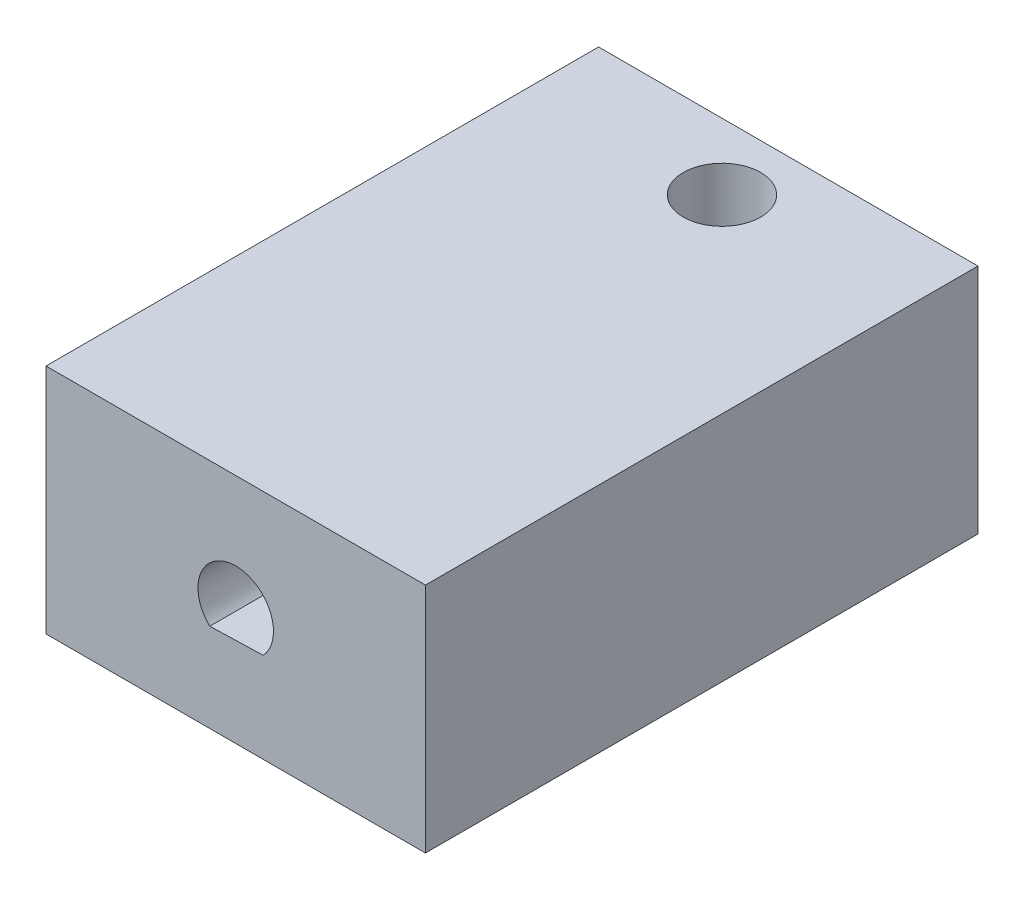
ISO-10303-21;
HEADER;
FILE_DESCRIPTION(('STEP AP214'),'2;1');
FILE_NAME('part.step','',(''),(''),'','','');
FILE_SCHEMA(('AUTOMOTIVE_DESIGN { 1 0 10303 214 1 1 1 1 }'));
ENDSEC;
DATA;
#1=APPLICATION_CONTEXT('core data for automotive mechanical design processes');
#2=APPLICATION_PROTOCOL_DEFINITION('international standard','automotive_design',2000,#1);
#3=PRODUCT_CONTEXT('',#1,'mechanical');
#4=PRODUCT('Part','Part','',(#3));
#5=PRODUCT_RELATED_PRODUCT_CATEGORY('part','',(#4));
#6=PRODUCT_DEFINITION_FORMATION('','',#4);
#7=PRODUCT_DEFINITION_CONTEXT('part definition',#1,'design');
#8=PRODUCT_DEFINITION('design','',#6,#7);
#9=PRODUCT_DEFINITION_SHAPE('','',#8);
#10=(LENGTH_UNIT() NAMED_UNIT(*) SI_UNIT(.MILLI.,.METRE.));
#11=(NAMED_UNIT(*) PLANE_ANGLE_UNIT() SI_UNIT($,.RADIAN.));
#12=(NAMED_UNIT(*) SI_UNIT($,.STERADIAN.) SOLID_ANGLE_UNIT());
#13=UNCERTAINTY_MEASURE_WITH_UNIT(LENGTH_MEASURE(1.E-05),#10,'distance_accuracy_value','');
#14=(GEOMETRIC_REPRESENTATION_CONTEXT(3) GLOBAL_UNCERTAINTY_ASSIGNED_CONTEXT((#13)) GLOBAL_UNIT_ASSIGNED_CONTEXT((#10,
#11,#12)) REPRESENTATION_CONTEXT('',''));
#15=CARTESIAN_POINT('',(0.,0.,0.));
#16=DIRECTION('',(0.,0.,1.));
#17=DIRECTION('',(1.,0.,0.));
#18=AXIS2_PLACEMENT_3D('',#15,#16,#17);
#19=CARTESIAN_POINT('',(0.,0.,0.));
#20=DIRECTION('',(0.,0.,1.));
#21=DIRECTION('',(1.,0.,0.));
#22=AXIS2_PLACEMENT_3D('',#19,#20,#21);
#23=CYLINDRICAL_SURFACE('',#22,2.05);
#24=DIRECTION('',(0.,0.,1.));
#25=VECTOR('',#24,1.);
#26=CARTESIAN_POINT('',(-1.40815423621281,-1.48983275807586,0.));
#27=LINE('',#26,#25);
#28=CARTESIAN_POINT('',(-1.40815423621281,-1.48983275807586,5.15791580229354));
#29=VERTEX_POINT('',#28);
#30=CARTESIAN_POINT('',(-1.40815423621281,-1.48983275807586,30.));
#31=VERTEX_POINT('',#30);
#32=EDGE_CURVE('E61',#29,#31,#27,.T.);
#33=ORIENTED_EDGE('',*,*,#32,.F.);
#34=CARTESIAN_POINT('',(-1.40815423621281,-1.48983275807586,5.15791580229354));
#35=CARTESIAN_POINT('',(-1.46072595876663,-1.4401052639686,5.11038785072848));
#36=CARTESIAN_POINT('',(-1.50983627572329,-1.38845438215111,5.06117473554368));
#37=CARTESIAN_POINT('',(-1.60136165196883,-1.28183538172913,4.96025175632157));
#38=CARTESIAN_POINT('',(-1.64378069794721,-1.22686926555099,4.90854340312661));
#39=CARTESIAN_POINT('',(-1.72288829557476,-1.11311814906605,4.80254024968019));
#40=CARTESIAN_POINT('',(-1.75946565693852,-1.05428370461202,4.74821625134745));
#41=CARTESIAN_POINT('',(-1.82623513684594,-0.933868657104844,4.63873363889227));
#42=CARTESIAN_POINT('',(-1.85642918965869,-0.872288892806526,4.58357528304107));
#43=CARTESIAN_POINT('',(-1.90041664053693,-0.76989914588715,4.49435931142008));
#44=CARTESIAN_POINT('',(-1.91610462630804,-0.729999153578874,4.46017668109492));
#45=CARTESIAN_POINT('',(-1.94510870898345,-0.648779868574377,4.39240662525315));
#46=CARTESIAN_POINT('',(-1.95842284917883,-0.607459438196541,4.35881971111795));
#47=CARTESIAN_POINT('',(-1.98255245988595,-0.523342796035227,4.29332135803781));
#48=CARTESIAN_POINT('',(-1.99338635556343,-0.480560374461849,4.26139902202847));
#49=CARTESIAN_POINT('',(-2.01258094783862,-0.392495143611016,4.2004353703747));
#50=CARTESIAN_POINT('',(-2.02094718381927,-0.347218209601734,4.17138770070095));
#51=CARTESIAN_POINT('',(-2.03171465834737,-0.274407701619131,4.13136955444224));
#52=CARTESIAN_POINT('',(-2.0350929316301,-0.248245125072647,4.11821287360524));
#53=CARTESIAN_POINT('',(-2.04092566132897,-0.19455554011108,4.09473946093028));
#54=CARTESIAN_POINT('',(-2.04338078362491,-0.167029531438269,4.08442068352727));
#55=CARTESIAN_POINT('',(-2.04725715557626,-0.109884811462834,4.06777752923863));
#56=CARTESIAN_POINT('',(-2.04865058455454,-0.0802307183702288,4.06156117521208));
#57=CARTESIAN_POINT('',(-2.05011722198152,-0.0202804814999997,4.05500985267489));
#58=CARTESIAN_POINT('',(-2.05019415439684,0.0100136084548958,4.05465829451919));
#59=CARTESIAN_POINT('',(-2.04902678339541,0.0699093920586796,4.0598840634812));
#60=CARTESIAN_POINT('',(-2.04778710795098,0.0995131396608114,4.06544062321313));
#61=CARTESIAN_POINT('',(-2.04415213674626,0.157456254903078,4.08114967815378));
#62=CARTESIAN_POINT('',(-2.04175176408274,0.18578946459092,4.09132235214994));
#63=CARTESIAN_POINT('',(-2.03521826652576,0.248225988943511,4.11779805496029));
#64=CARTESIAN_POINT('',(-2.03079612429173,0.281899834017134,4.13500861840543));
#65=CARTESIAN_POINT('',(-2.02061342450096,0.347449560862371,4.17227666261223));
#66=CARTESIAN_POINT('',(-2.01484983135898,0.379321157883914,4.19234055954969));
#67=CARTESIAN_POINT('',(-1.99565263282213,0.473279021930297,4.25519099572552));
#68=CARTESIAN_POINT('',(-1.98035770386526,0.53331877660188,4.30043357594979));
#69=CARTESIAN_POINT('',(-1.94309887201904,0.656862900525792,4.39840878477754));
#70=CARTESIAN_POINT('',(-1.92057106674652,0.71997414422435,4.45140513027165));
#71=CARTESIAN_POINT('',(-1.86967476710487,0.843367312793429,4.5580247596515));
#72=CARTESIAN_POINT('',(-1.84130070326806,0.903646471920357,4.61164859503142));
#73=CARTESIAN_POINT('',(-1.77867249424366,1.02139745543362,4.71809177885831));
#74=CARTESIAN_POINT('',(-1.74443848141531,1.07887805367711,4.77091322900558));
#75=CARTESIAN_POINT('',(-1.66983636377927,1.19108390393229,4.87504819416792));
#76=CARTESIAN_POINT('',(-1.62947173223454,1.24581069287153,4.92636254350027));
#77=CARTESIAN_POINT('',(-1.51934480562176,1.38026554275981,5.05323934102415));
#78=CARTESIAN_POINT('',(-1.44530212092055,1.45796570752467,5.12732508270295));
#79=CARTESIAN_POINT('',(-1.28150322211045,1.60382015844931,5.26712833950586));
#80=CARTESIAN_POINT('',(-1.19176525651842,1.6719853668079,5.33285542141709));
#81=CARTESIAN_POINT('',(-1.01867025695916,1.78122575484393,5.43851035217611));
#82=CARTESIAN_POINT('',(-0.938501647051748,1.82493644251659,5.48090626459752));
#83=CARTESIAN_POINT('',(-0.76931249852997,1.90244479175973,5.55619822557943));
#84=CARTESIAN_POINT('',(-0.680297212782123,1.93624828935925,5.58909986675408));
#85=CARTESIAN_POINT('',(-0.49415251793504,1.99194066027947,5.64335204486058));
#86=CARTESIAN_POINT('',(-0.396952936141798,2.0137110936783,5.66458774339831));
#87=CARTESIAN_POINT('',(-0.198430877742551,2.04282908203838,5.69299787794504));
#88=CARTESIAN_POINT('',(-0.0971131230477907,2.05019270483358,5.70018797891531));
#89=CARTESIAN_POINT('',(0.090060543797335,2.04982874962433,5.69983294389339));
#90=CARTESIAN_POINT('',(0.175937168539728,2.04421533686945,5.69435210142198));
#91=CARTESIAN_POINT('',(0.345061361446952,2.02254756890112,5.67320839986189));
#92=CARTESIAN_POINT('',(0.428308747752626,2.0064924931099,5.65754483806514));
#93=CARTESIAN_POINT('',(0.588818331655834,1.96534006004454,5.61743415932635));
#94=CARTESIAN_POINT('',(0.666152861541083,1.94038549225447,5.59312576227703));
#95=CARTESIAN_POINT('',(0.814959637007834,1.88274225527095,5.53705308525009));
#96=CARTESIAN_POINT('',(0.886430028721757,1.85005115286726,5.50528645961694));
#97=CARTESIAN_POINT('',(1.05522435943943,1.76122431578013,5.41913160531703));
#98=CARTESIAN_POINT('',(1.14874496628292,1.70132077327748,5.36115797665548));
#99=CARTESIAN_POINT('',(1.32123831826599,1.571168013644,5.23577930881212));
#100=CARTESIAN_POINT('',(1.40016775927796,1.5008890800398,5.16834720796679));
#101=CARTESIAN_POINT('',(1.57069048918538,1.32497369068418,5.00072537578338));
#102=CARTESIAN_POINT('',(1.65601348423593,1.21593134974888,4.8977035707251));
#103=CARTESIAN_POINT('',(1.76517896350091,1.04461197951695,4.73941214664669));
#104=CARTESIAN_POINT('',(1.79842633943167,0.98622492968633,4.68603258028578));
#105=CARTESIAN_POINT('',(1.85893253429065,0.866806657624313,4.57884661374421));
#106=CARTESIAN_POINT('',(1.88619463949404,0.805776908544838,4.52504046468371));
#107=CARTESIAN_POINT('',(1.92891258083825,0.695964409218997,4.43142170837511));
#108=CARTESIAN_POINT('',(1.9456252706999,0.647836144333785,4.39140457725054));
#109=CARTESIAN_POINT('',(1.9757464110151,0.54917854301788,4.31287069555458));
#110=CARTESIAN_POINT('',(1.98914948640493,0.498645457644897,4.27435647010664));
#111=CARTESIAN_POINT('',(2.01021653441332,0.404226040316192,4.20826812297202));
#112=CARTESIAN_POINT('',(2.0184893701762,0.360950074106205,4.18002051686793));
#113=CARTESIAN_POINT('',(2.03251682298398,0.270990499035976,4.12873958168776));
#114=CARTESIAN_POINT('',(2.0382825044833,0.224322945612066,4.10568356337581));
#115=CARTESIAN_POINT('',(2.04474048866354,0.149098497609969,4.07868401727659));
#116=CARTESIAN_POINT('',(2.04654635746253,0.122103512675873,4.07082892583998));
#117=CARTESIAN_POINT('',(2.0490824201587,0.0671712665773229,4.05966820467643));
#118=CARTESIAN_POINT('',(2.0498160747706,0.0392373359806315,4.05634794046954));
#119=CARTESIAN_POINT('',(2.05012322906244,-0.0169277901047765,4.05496853419986));
#120=CARTESIAN_POINT('',(2.04969040106275,-0.0451597760784239,4.05693808698049));
#121=CARTESIAN_POINT('',(2.04770936081155,-0.100837538913112,4.06572933783776));
#122=CARTESIAN_POINT('',(2.04615832820992,-0.128281144954737,4.07256330444809));
#123=CARTESIAN_POINT('',(2.04220978678087,-0.180342027086592,4.08933407384598));
#124=CARTESIAN_POINT('',(2.03986580735057,-0.205031167046497,4.09907089731753));
#125=CARTESIAN_POINT('',(2.03443537648998,-0.253302623173413,4.1207672582427));
#126=CARTESIAN_POINT('',(2.03134883840891,-0.276884809783532,4.13272705506283));
#127=CARTESIAN_POINT('',(2.02231231850204,-0.337981466788771,4.16631751890859));
#128=CARTESIAN_POINT('',(2.01579742202397,-0.374702087567059,4.18922099652561));
#129=CARTESIAN_POINT('',(2.00114780002328,-0.446364943769399,4.23721738697977));
#130=CARTESIAN_POINT('',(1.99301065255741,-0.481304420899645,4.26231354152525));
#131=CARTESIAN_POINT('',(1.96621110791078,-0.584462461846287,4.33957471829017));
#132=CARTESIAN_POINT('',(1.94520611347937,-0.650731972447298,4.3935298941111));
#133=CARTESIAN_POINT('',(1.89684071587501,-0.78058773753741,4.50313661408542));
#134=CARTESIAN_POINT('',(1.86941868451949,-0.844140414525308,4.55879974451737));
#135=CARTESIAN_POINT('',(1.8082504952058,-0.968247358754713,4.66968477574737));
#136=CARTESIAN_POINT('',(1.77452031946858,-1.02880872503074,4.72490743173797));
#137=CARTESIAN_POINT('',(1.71976749893786,-1.1162501234936,4.8055701866559));
#138=CARTESIAN_POINT('',(1.70127500572468,-1.14424581878252,4.83154346171363));
#139=CARTESIAN_POINT('',(1.66274212314729,-1.19955211594302,4.88309145370124));
#140=CARTESIAN_POINT('',(1.64270134048285,-1.22686254139118,4.90866606736632));
#141=CARTESIAN_POINT('',(1.60128298080305,-1.28043996672477,4.95902316717663));
#142=CARTESIAN_POINT('',(1.57992308013554,-1.30671527280343,4.98381134012291));
#143=CARTESIAN_POINT('',(1.53563946948186,-1.35848078035254,5.03279477386452));
#144=CARTESIAN_POINT('',(1.51271592999581,-1.38397106698343,5.05699009891452));
#145=CARTESIAN_POINT('',(1.48899480603833,-1.40904026471598,5.08084248574616));
#146=B_SPLINE_CURVE_WITH_KNOTS('',3,(#34,#35,#36,#37,#38,#39,#40,#41,#42,#43,#44,#45,#46,#47,
#48,#49,#50,#51,#52,#53,#54,#55,#56,#57,#58,#59,#60,#61,#62,#63,#64,#65,#66,#67,#68,#69,#70,#71,
#72,#73,#74,#75,#76,#77,#78,#79,#80,#81,#82,#83,#84,#85,#86,#87,#88,#89,#90,#91,#92,#93,#94,#95,
#96,#97,#98,#99,#100,#101,#102,#103,#104,#105,#106,#107,#108,#109,#110,#111,#112,#113,#114,#115,
#116,#117,#118,#119,#120,#121,#122,#123,#124,#125,#126,#127,#128,#129,#130,#131,#132,#133,#134,
#135,#136,#137,#138,#139,#140,#141,#142,#143,#144,#145),.UNSPECIFIED.,.F.,.F.,(4,2,2,2,2,2,2,2,
2,2,2,2,2,2,2,2,2,2,2,2,2,2,2,2,2,2,2,2,2,2,2,2,2,2,2,2,2,2,2,2,2,2,2,2,2,2,2,2,2,2,2,2,2,2,2,
4),(0.,0.259519351744423,0.518883491854005,0.782711455856059,1.04645935980021,1.21089852381115,
1.37547261102207,1.53878128548575,1.70172052609857,1.79003369381263,1.87828303742587,
1.96877211405163,2.05900518227588,2.14892212120765,2.23923596515344,2.35317549485,
2.46737541053306,2.69708784859072,2.95316230212262,3.20948184365402,3.46493783135226,
3.7202496282566,4.11014471935758,4.49958946651817,4.80048545579053,5.10120383833807,
5.40483171273529,5.70812075921552,5.9655355572028,6.22296812123602,6.47644349278047,
6.72999869082084,7.10374045571316,7.47857421453487,7.99332257908254,8.25059719584413,
8.50773019805061,8.70198683295196,8.89655691041586,9.0534108472323,9.20956535929845,
9.29377597997518,9.37771419470723,9.462108654305,9.54671672274281,9.62648221635934,
9.70625702250307,9.83733810475911,9.96861637040978,10.2322006115913,10.4984284496551,
10.763990696832,10.891253939216,11.0185496162887,11.1444060297571,11.2702487416376),.UNSPECIFIED.);
#147=CARTESIAN_POINT('',(1.48899480603833,-1.40904026471598,5.08084248574616));
#148=VERTEX_POINT('',#147);
#149=EDGE_CURVE('E54',#29,#148,#146,.T.);
#150=ORIENTED_EDGE('',*,*,#149,.T.);
#151=DIRECTION('',(0.,0.,1.));
#152=VECTOR('',#151,1.);
#153=CARTESIAN_POINT('',(1.48899480603833,-1.40904026471598,0.));
#154=LINE('',#153,#152);
#155=CARTESIAN_POINT('',(1.48899480603833,-1.40904026471598,30.));
#156=VERTEX_POINT('',#155);
#157=EDGE_CURVE('E109',#148,#156,#154,.T.);
#158=ORIENTED_EDGE('',*,*,#157,.T.);
#159=CARTESIAN_POINT('',(0.,0.,30.));
#160=DIRECTION('',(0.,0.,1.));
#161=DIRECTION('',(-1.,0.,0.));
#162=AXIS2_PLACEMENT_3D('',#159,#160,#161);
#163=CIRCLE('',#162,2.05);
#164=EDGE_CURVE('E221',#156,#31,#163,.T.);
#165=ORIENTED_EDGE('',*,*,#164,.T.);
#166=EDGE_LOOP('',(#33,#150,#158,#165));
#167=FACE_BOUND('',#166,.T.);
#168=ADVANCED_FACE('F39',(#167),#23,.F.);
#169=CARTESIAN_POINT('',(-1.40815423621281,-1.48983275807586,0.));
#170=DIRECTION('',(0.0278760585605222,-0.999611387169599,0.));
#171=DIRECTION('',(0.999611387169599,0.0278760585605222,0.));
#172=AXIS2_PLACEMENT_3D('',#169,#170,#171);
#173=PLANE('',#172);
#174=CARTESIAN_POINT('',(-1.40815423621281,-1.48983275807586,0.));
#175=VERTEX_POINT('',#174);
#176=CARTESIAN_POINT('',(-1.40815423621281,-1.48983275807586,2.04208419770646));
#177=VERTEX_POINT('',#176);
#178=EDGE_CURVE('E120',#175,#177,#27,.T.);
#179=ORIENTED_EDGE('',*,*,#178,.T.);
#180=CARTESIAN_POINT('',(0.,-1.45056370766811,3.6));
#181=DIRECTION('',(0.0278760585605222,-0.999611387169599,0.));
#182=DIRECTION('',(-0.999611387169599,-0.0278760585605222,0.));
#183=AXIS2_PLACEMENT_3D('',#180,#181,#182);
#184=ELLIPSE('',#183,2.10081640420899,2.1);
#185=CARTESIAN_POINT('',(1.48899480603833,-1.40904026471598,2.11915751425384));
#186=VERTEX_POINT('',#185);
#187=EDGE_CURVE('E11',#177,#186,#184,.T.);
#188=ORIENTED_EDGE('',*,*,#187,.T.);
#189=CARTESIAN_POINT('',(1.48899480603833,-1.40904026471598,0.));
#190=VERTEX_POINT('',#189);
#191=EDGE_CURVE('E119',#190,#186,#154,.T.);
#192=ORIENTED_EDGE('',*,*,#191,.F.);
#193=DIRECTION('',(0.999611387169599,0.0278760585605222,0.));
#194=VECTOR('',#193,1.);
#195=CARTESIAN_POINT('',(-1.40815423621281,-1.48983275807586,0.));
#196=LINE('',#195,#194);
#197=EDGE_CURVE('E225',#175,#190,#196,.T.);
#198=ORIENTED_EDGE('',*,*,#197,.F.);
#199=EDGE_LOOP('',(#179,#188,#192,#198));
#200=FACE_BOUND('',#199,.T.);
#201=ADVANCED_FACE('F204',(#200),#173,.F.);
#202=CARTESIAN_POINT('',(10.3,6.3,30.));
#203=DIRECTION('',(-1.,0.,0.));
#204=DIRECTION('',(0.,0.,1.));
#205=AXIS2_PLACEMENT_3D('',#202,#203,#204);
#206=PLANE('',#205);
#207=DIRECTION('',(0.,1.,0.));
#208=VECTOR('',#207,1.);
#209=CARTESIAN_POINT('',(10.3,6.3,0.));
#210=LINE('',#209,#208);
#211=CARTESIAN_POINT('',(10.3,-6.3,0.));
#212=VERTEX_POINT('',#211);
#213=CARTESIAN_POINT('',(10.3,6.3,0.));
#214=VERTEX_POINT('',#213);
#215=EDGE_CURVE('E125',#212,#214,#210,.T.);
#216=ORIENTED_EDGE('',*,*,#215,.T.);
#217=DIRECTION('',(0.,0.,-1.));
#218=VECTOR('',#217,1.);
#219=CARTESIAN_POINT('',(10.3,6.3,30.));
#220=LINE('',#219,#218);
#221=CARTESIAN_POINT('',(10.3,6.3,30.));
#222=VERTEX_POINT('',#221);
#223=EDGE_CURVE('E107',#222,#214,#220,.T.);
#224=ORIENTED_EDGE('',*,*,#223,.F.);
#225=DIRECTION('',(0.,1.,0.));
#226=VECTOR('',#225,1.);
#227=CARTESIAN_POINT('',(10.3,6.3,30.));
#228=LINE('',#227,#226);
#229=CARTESIAN_POINT('',(10.3,-6.3,30.));
#230=VERTEX_POINT('',#229);
#231=EDGE_CURVE('E131',#230,#222,#228,.T.);
#232=ORIENTED_EDGE('',*,*,#231,.F.);
#233=DIRECTION('',(0.,0.,-1.));
#234=VECTOR('',#233,1.);
#235=CARTESIAN_POINT('',(10.3,-6.3,30.));
#236=LINE('',#235,#234);
#237=EDGE_CURVE('E145',#230,#212,#236,.T.);
#238=ORIENTED_EDGE('',*,*,#237,.T.);
#239=EDGE_LOOP('',(#216,#224,#232,#238));
#240=FACE_BOUND('',#239,.T.);
#241=ADVANCED_FACE('F41',(#240),#206,.F.);
#242=CARTESIAN_POINT('',(-10.3,6.3,30.));
#243=DIRECTION('',(0.,-1.,0.));
#244=DIRECTION('',(0.,0.,-1.));
#245=AXIS2_PLACEMENT_3D('',#242,#243,#244);
#246=PLANE('',#245);
#247=CARTESIAN_POINT('',(0.,6.3,3.6));
#248=DIRECTION('',(0.,-1.,0.));
#249=DIRECTION('',(0.,0.,-1.));
#250=AXIS2_PLACEMENT_3D('',#247,#248,#249);
#251=CIRCLE('',#250,2.1);
#252=CARTESIAN_POINT('',(0.,6.3,1.5));
#253=VERTEX_POINT('',#252);
#254=EDGE_CURVE('E242',#253,#253,#251,.T.);
#255=ORIENTED_EDGE('',*,*,#254,.T.);
#256=EDGE_LOOP('',(#255));
#257=FACE_BOUND('',#256,.T.);
#258=DIRECTION('',(-1.,0.,0.));
#259=VECTOR('',#258,1.);
#260=CARTESIAN_POINT('',(-10.3,6.3,0.));
#261=LINE('',#260,#259);
#262=CARTESIAN_POINT('',(-10.3,6.3,0.));
#263=VERTEX_POINT('',#262);
#264=EDGE_CURVE('E149',#214,#263,#261,.T.);
#265=ORIENTED_EDGE('',*,*,#264,.T.);
#266=DIRECTION('',(0.,0.,-1.));
#267=VECTOR('',#266,1.);
#268=CARTESIAN_POINT('',(-10.3,6.3,30.));
#269=LINE('',#268,#267);
#270=CARTESIAN_POINT('',(-10.3,6.3,30.));
#271=VERTEX_POINT('',#270);
#272=EDGE_CURVE('E164',#271,#263,#269,.T.);
#273=ORIENTED_EDGE('',*,*,#272,.F.);
#274=DIRECTION('',(-1.,0.,0.));
#275=VECTOR('',#274,1.);
#276=CARTESIAN_POINT('',(-10.3,6.3,30.));
#277=LINE('',#276,#275);
#278=EDGE_CURVE('E135',#222,#271,#277,.T.);
#279=ORIENTED_EDGE('',*,*,#278,.F.);
#280=ORIENTED_EDGE('',*,*,#223,.T.);
#281=EDGE_LOOP('',(#265,#273,#279,#280));
#282=FACE_BOUND('',#281,.T.);
#283=ADVANCED_FACE('F171',(#257,#282),#246,.F.);
#284=CARTESIAN_POINT('',(-10.3,6.3,30.));
#285=DIRECTION('',(1.,0.,0.));
#286=DIRECTION('',(0.,0.,-1.));
#287=AXIS2_PLACEMENT_3D('',#284,#285,#286);
#288=PLANE('',#287);
#289=DIRECTION('',(0.,-1.,0.));
#290=VECTOR('',#289,1.);
#291=CARTESIAN_POINT('',(-10.3,6.3,0.));
#292=LINE('',#291,#290);
#293=CARTESIAN_POINT('',(-10.3,-6.3,0.));
#294=VERTEX_POINT('',#293);
#295=EDGE_CURVE('E152',#263,#294,#292,.T.);
#296=ORIENTED_EDGE('',*,*,#295,.T.);
#297=DIRECTION('',(0.,0.,-1.));
#298=VECTOR('',#297,1.);
#299=CARTESIAN_POINT('',(-10.3,-6.3,30.));
#300=LINE('',#299,#298);
#301=CARTESIAN_POINT('',(-10.3,-6.3,30.));
#302=VERTEX_POINT('',#301);
#303=EDGE_CURVE('E160',#302,#294,#300,.T.);
#304=ORIENTED_EDGE('',*,*,#303,.F.);
#305=DIRECTION('',(0.,-1.,0.));
#306=VECTOR('',#305,1.);
#307=CARTESIAN_POINT('',(-10.3,6.3,30.));
#308=LINE('',#307,#306);
#309=EDGE_CURVE('E139',#271,#302,#308,.T.);
#310=ORIENTED_EDGE('',*,*,#309,.F.);
#311=ORIENTED_EDGE('',*,*,#272,.T.);
#312=EDGE_LOOP('',(#296,#304,#310,#311));
#313=FACE_BOUND('',#312,.T.);
#314=ADVANCED_FACE('F183',(#313),#288,.F.);
#315=CARTESIAN_POINT('',(-10.3,-6.3,30.));
#316=DIRECTION('',(0.,1.,0.));
#317=DIRECTION('',(0.,0.,1.));
#318=AXIS2_PLACEMENT_3D('',#315,#316,#317);
#319=PLANE('',#318);
#320=CARTESIAN_POINT('',(0.,-6.3,3.6));
#321=DIRECTION('',(0.,-1.,0.));
#322=DIRECTION('',(0.,0.,-1.));
#323=AXIS2_PLACEMENT_3D('',#320,#321,#322);
#324=CIRCLE('',#323,2.1);
#325=CARTESIAN_POINT('',(0.,-6.3,1.5));
#326=VERTEX_POINT('',#325);
#327=EDGE_CURVE('E112',#326,#326,#324,.T.);
#328=ORIENTED_EDGE('',*,*,#327,.F.);
#329=EDGE_LOOP('',(#328));
#330=FACE_BOUND('',#329,.T.);
#331=DIRECTION('',(1.,0.,0.));
#332=VECTOR('',#331,1.);
#333=CARTESIAN_POINT('',(-10.3,-6.3,0.));
#334=LINE('',#333,#332);
#335=EDGE_CURVE('E136',#294,#212,#334,.T.);
#336=ORIENTED_EDGE('',*,*,#335,.T.);
#337=ORIENTED_EDGE('',*,*,#237,.F.);
#338=DIRECTION('',(1.,0.,0.));
#339=VECTOR('',#338,1.);
#340=CARTESIAN_POINT('',(-10.3,-6.3,30.));
#341=LINE('',#340,#339);
#342=EDGE_CURVE('E142',#302,#230,#341,.T.);
#343=ORIENTED_EDGE('',*,*,#342,.F.);
#344=ORIENTED_EDGE('',*,*,#303,.T.);
#345=EDGE_LOOP('',(#336,#337,#343,#344));
#346=FACE_BOUND('',#345,.T.);
#347=ADVANCED_FACE('F187',(#330,#346),#319,.F.);
#348=CARTESIAN_POINT('',(0.,0.,30.));
#349=DIRECTION('',(0.,0.,1.));
#350=DIRECTION('',(1.,0.,0.));
#351=AXIS2_PLACEMENT_3D('',#348,#349,#350);
#352=PLANE('',#351);
#353=ORIENTED_EDGE('',*,*,#164,.F.);
#354=DIRECTION('',(0.999611387169599,0.0278760585605222,0.));
#355=VECTOR('',#354,1.);
#356=CARTESIAN_POINT('',(-1.40815423621281,-1.48983275807586,30.));
#357=LINE('',#356,#355);
#358=EDGE_CURVE('E116',#31,#156,#357,.T.);
#359=ORIENTED_EDGE('',*,*,#358,.F.);
#360=EDGE_LOOP('',(#353,#359));
#361=FACE_BOUND('',#360,.T.);
#362=ORIENTED_EDGE('',*,*,#231,.T.);
#363=ORIENTED_EDGE('',*,*,#278,.T.);
#364=ORIENTED_EDGE('',*,*,#309,.T.);
#365=ORIENTED_EDGE('',*,*,#342,.T.);
#366=EDGE_LOOP('',(#362,#363,#364,#365));
#367=FACE_BOUND('',#366,.T.);
#368=ADVANCED_FACE('F189',(#361,#367),#352,.T.);
#369=CARTESIAN_POINT('',(0.,0.,0.));
#370=DIRECTION('',(0.,0.,1.));
#371=DIRECTION('',(1.,0.,0.));
#372=AXIS2_PLACEMENT_3D('',#369,#370,#371);
#373=PLANE('',#372);
#374=ORIENTED_EDGE('',*,*,#197,.T.);
#375=CARTESIAN_POINT('',(0.,0.,0.));
#376=DIRECTION('',(0.,0.,1.));
#377=DIRECTION('',(-1.,0.,0.));
#378=AXIS2_PLACEMENT_3D('',#375,#376,#377);
#379=CIRCLE('',#378,2.05);
#380=EDGE_CURVE('E228',#190,#175,#379,.T.);
#381=ORIENTED_EDGE('',*,*,#380,.T.);
#382=EDGE_LOOP('',(#374,#381));
#383=FACE_BOUND('',#382,.T.);
#384=ORIENTED_EDGE('',*,*,#215,.F.);
#385=ORIENTED_EDGE('',*,*,#335,.F.);
#386=ORIENTED_EDGE('',*,*,#295,.F.);
#387=ORIENTED_EDGE('',*,*,#264,.F.);
#388=EDGE_LOOP('',(#384,#385,#386,#387));
#389=FACE_BOUND('',#388,.T.);
#390=ADVANCED_FACE('F179',(#383,#389),#373,.F.);
#391=CARTESIAN_POINT('',(1.48899480603833,-1.40904026471598,2.11915751425384));
#392=CARTESIAN_POINT('',(1.53776270727272,-1.35746238927751,2.1682004817364));
#393=CARTESIAN_POINT('',(1.5831595525495,-1.30416973570181,2.21868473404241));
#394=CARTESIAN_POINT('',(1.66745613973907,-1.19452944830269,2.32171047958064));
#395=CARTESIAN_POINT('',(1.70635687025138,-1.13818228105694,2.37425165827816));
#396=CARTESIAN_POINT('',(1.77863382615073,-1.02164214097018,2.48164057099648));
#397=CARTESIAN_POINT('',(1.81188454598136,-0.961394913766072,2.5365134035668));
#398=CARTESIAN_POINT('',(1.87210187473087,-0.838117256526819,2.64649773922473));
#399=CARTESIAN_POINT('',(1.89907122245149,-0.775088053801078,2.70160912758035));
#400=CARTESIAN_POINT('',(1.94661493836165,-0.646424518967156,2.80998948536821));
#401=CARTESIAN_POINT('',(1.96726004191341,-0.580829016382882,2.86327242886404));
#402=CARTESIAN_POINT('',(1.99359766048562,-0.478832195673371,2.93947348432444));
#403=CARTESIAN_POINT('',(2.00158571564344,-0.444356457433216,2.96417519752439));
#404=CARTESIAN_POINT('',(2.01598183908246,-0.373660004013975,3.01142659663165));
#405=CARTESIAN_POINT('',(2.02239215002034,-0.337441854189884,3.03397930890446));
#406=CARTESIAN_POINT('',(2.03102826985453,-0.279052124775215,3.06608128650077));
#407=CARTESIAN_POINT('',(2.03385346065251,-0.257721211629993,3.0769822818382));
#408=CARTESIAN_POINT('',(2.03890332330079,-0.214139128434085,3.09702932766319));
#409=CARTESIAN_POINT('',(2.04112737247832,-0.191887031499792,3.10617355564797));
#410=CARTESIAN_POINT('',(2.04516691886333,-0.143090232123286,3.12315627939876));
#411=CARTESIAN_POINT('',(2.04687457622254,-0.116394777409332,3.1306062753588));
#412=CARTESIAN_POINT('',(2.04923735105901,-0.0621188159307219,3.14102575990641));
#413=CARTESIAN_POINT('',(2.04989523147405,-0.0345408279596038,3.1440070086573));
#414=CARTESIAN_POINT('',(2.0500818323656,0.020826370902306,3.14484641860051));
#415=CARTESIAN_POINT('',(2.04960553470788,0.0486159762063308,3.14268181219358));
#416=CARTESIAN_POINT('',(2.04757539104106,0.103398762010315,3.13367948425812));
#417=CARTESIAN_POINT('',(2.04601904912292,0.130389946468654,3.12683093899553));
#418=CARTESIAN_POINT('',(2.0406818639221,0.200015142785585,3.10420023625887));
#419=CARTESIAN_POINT('',(2.03611476383545,0.241600607732802,3.08550569280013));
#420=CARTESIAN_POINT('',(2.02496697373118,0.321972990861742,3.04322626474907));
#421=CARTESIAN_POINT('',(2.01837536796837,0.360743293638775,3.01961509852817));
#422=CARTESIAN_POINT('',(1.99805648347914,0.463298390756265,2.95213308881648));
#423=CARTESIAN_POINT('',(1.98259834540338,0.525130238669271,2.90585516779601));
#424=CARTESIAN_POINT('',(1.9467504692335,0.645432789279501,2.81083162684534));
#425=CARTESIAN_POINT('',(1.92635086746012,0.703896476174197,2.76208122742824));
#426=CARTESIAN_POINT('',(1.8805548848178,0.818426945328469,2.66380812420817));
#427=CARTESIAN_POINT('',(1.85514728786845,0.87448799702251,2.61428392089556));
#428=CARTESIAN_POINT('',(1.79928186935075,0.98431471993689,2.51565629127146));
#429=CARTESIAN_POINT('',(1.76882828502382,1.03808226983209,2.46655254796884));
#430=CARTESIAN_POINT('',(1.70038943702479,1.14699126175553,2.36605555301809));
#431=CARTESIAN_POINT('',(1.6620289696314,1.20197059106417,2.31473879411732));
#432=CARTESIAN_POINT('',(1.57910978273683,1.30900921750061,2.21411545826431));
#433=CARTESIAN_POINT('',(1.53454825960487,1.3610671787914,2.16480980368798));
#434=CARTESIAN_POINT('',(1.39148931113818,1.51173798039067,2.02142824961371));
#435=CARTESIAN_POINT('',(1.2832419709071,1.60546450029457,1.93131092883817));
#436=CARTESIAN_POINT('',(1.08848390065959,1.73943135500027,1.80195608317425));
#437=CARTESIAN_POINT('',(1.01034891242656,1.7861516367404,1.75670472766907));
#438=CARTESIAN_POINT('',(0.844738288852951,1.8701650196814,1.67518546838805));
#439=CARTESIAN_POINT('',(0.757266589609028,1.90746207129997,1.63891380026583));
#440=CARTESIAN_POINT('',(0.573419373134505,1.97058841409948,1.57746026599916));
#441=CARTESIAN_POINT('',(0.476963510936859,1.99629920584667,1.55239301416001));
#442=CARTESIAN_POINT('',(0.278829447147331,2.03343739991222,1.51616932831031));
#443=CARTESIAN_POINT('',(0.17715802454306,2.04488287737214,1.50499529067844));
#444=CARTESIAN_POINT('',(-0.0124695263811964,2.05183387563314,1.49820974527434));
#445=CARTESIAN_POINT('',(-0.100286977184574,2.04940180888879,1.50058464988358));
#446=CARTESIAN_POINT('',(-0.273929315476651,2.03348469047403,1.51611973939445));
#447=CARTESIAN_POINT('',(-0.359754188072204,2.0199995562169,1.52928000488254));
#448=CARTESIAN_POINT('',(-0.52337823571049,1.98375988084484,1.56461605137501));
#449=CARTESIAN_POINT('',(-0.601363885837541,1.96142984583198,1.58637887097511));
#450=CARTESIAN_POINT('',(-0.751875895487306,1.90880814420471,1.63760024135583));
#451=CARTESIAN_POINT('',(-0.824400906877982,1.87851451976246,1.66706068456645));
#452=CARTESIAN_POINT('',(-0.99350172930479,1.79658518249968,1.74660292668687));
#453=CARTESIAN_POINT('',(-1.08677152678029,1.7414037216729,1.80007461939652));
#454=CARTESIAN_POINT('',(-1.2597766123748,1.62069564080964,1.91657754243046));
#455=CARTESIAN_POINT('',(-1.3394712265543,1.55513902868741,1.97963646569008));
#456=CARTESIAN_POINT('',(-1.51290122991189,1.39026539181293,2.13729295068367));
#457=CARTESIAN_POINT('',(-1.60069567678435,1.28750683391135,2.23485012402178));
#458=CARTESIAN_POINT('',(-1.71446363189068,1.12580819173437,2.38567661134585));
#459=CARTESIAN_POINT('',(-1.74938380968821,1.07068294254449,2.43666944048243));
#460=CARTESIAN_POINT('',(-1.81355552499445,0.957977527831226,2.53949079117538));
#461=CARTESIAN_POINT('',(-1.84280965438401,0.900398499542341,2.59131891882343));
#462=CARTESIAN_POINT('',(-1.8919134348557,0.791326319204744,2.68724480706928));
#463=CARTESIAN_POINT('',(-1.91251339916603,0.740182868417897,2.73135890847947));
#464=CARTESIAN_POINT('',(-1.9498505944008,0.635369555638283,2.81874883644025));
#465=CARTESIAN_POINT('',(-1.9665687597278,0.581688720235411,2.86201960738514));
#466=CARTESIAN_POINT('',(-1.99617252710283,0.470301131014006,2.94633356749479));
#467=CARTESIAN_POINT('',(-2.00900691909109,0.412552006346184,2.98734161218666));
#468=CARTESIAN_POINT('',(-2.02480625473071,0.321841245644239,3.04274217322705));
#469=CARTESIAN_POINT('',(-2.02948582884529,0.291049710005536,3.0601349495501));
#470=CARTESIAN_POINT('',(-2.03757056644261,0.227652784160261,3.09150809649329));
#471=CARTESIAN_POINT('',(-2.04097953883018,0.195053157222504,3.10549862155162));
#472=CARTESIAN_POINT('',(-2.04595435427346,0.132041364086489,3.12652798944858));
#473=CARTESIAN_POINT('',(-2.04769888211763,0.101874647191129,3.13422261908802));
#474=CARTESIAN_POINT('',(-2.04982378292031,0.0406317766509414,3.14365592792469));
#475=CARTESIAN_POINT('',(-2.0502099556579,0.0095600620766801,3.1454199277462));
#476=CARTESIAN_POINT('',(-2.04956765128224,-0.0522634351332741,3.142536448783));
#477=CARTESIAN_POINT('',(-2.04853813895556,-0.0830149670633569,3.13788427819478));
#478=CARTESIAN_POINT('',(-2.04521347510059,-0.143254325595518,3.1233944190531));
#479=CARTESIAN_POINT('',(-2.04291274764011,-0.172735963499558,3.11353389353672));
#480=CARTESIAN_POINT('',(-2.03840549609858,-0.218389940060724,3.09507087421745));
#481=CARTESIAN_POINT('',(-2.03654401086917,-0.235081913848444,3.08759837438439));
#482=CARTESIAN_POINT('',(-2.03248377479291,-0.267921947202119,3.07172257899824));
#483=CARTESIAN_POINT('',(-2.03028589487374,-0.284071283616635,3.06332170220012));
#484=CARTESIAN_POINT('',(-2.02231900827554,-0.337936653820279,3.03370753729271));
#485=CARTESIAN_POINT('',(-2.01581161611013,-0.374621892440996,3.0108289086036));
#486=CARTESIAN_POINT('',(-2.0011805540598,-0.446215419042604,2.96288648678499));
#487=CARTESIAN_POINT('',(-1.99305439022171,-0.481120859452618,2.9378193558456));
#488=CARTESIAN_POINT('',(-1.96629422714503,-0.584173082708776,2.86065147000727));
#489=CARTESIAN_POINT('',(-1.94532282848575,-0.650374908527313,2.8067618135792));
#490=CARTESIAN_POINT('',(-1.89698604656482,-0.780241244904725,2.69716510042613));
#491=CARTESIAN_POINT('',(-1.86954566191137,-0.84386486470025,2.64144388245113));
#492=CARTESIAN_POINT('',(-1.80832652924853,-0.968110901892063,2.53043970405295));
#493=CARTESIAN_POINT('',(-1.77456325562957,-1.02874019912406,2.47515601002824));
#494=CARTESIAN_POINT('',(-1.71491098745824,-1.12400604695288,2.38727500650135));
#495=CARTESIAN_POINT('',(-1.69109159176636,-1.15955208206102,2.35424438525131));
#496=CARTESIAN_POINT('',(-1.64093010568787,-1.22951288402107,2.28887638198459));
#497=CARTESIAN_POINT('',(-1.61458737292816,-1.26392735979757,2.25653917907129));
#498=CARTESIAN_POINT('',(-1.55970305243542,-1.33104482479693,2.1932098121534));
#499=CARTESIAN_POINT('',(-1.53119664596211,-1.36376483172115,2.16220527283134));
#500=CARTESIAN_POINT('',(-1.47161575776558,-1.4278507707495,2.10128018216595));
#501=CARTESIAN_POINT('',(-1.44054110587983,-1.45921661292168,2.07135970283768));
#502=CARTESIAN_POINT('',(-1.40815423621281,-1.48983275807586,2.04208419770646));
#503=B_SPLINE_CURVE_WITH_KNOTS('',3,(#391,#392,#393,#394,#395,#396,#397,#398,#399,#400,#401,
#402,#403,#404,#405,#406,#407,#408,#409,#410,#411,#412,#413,#414,#415,#416,#417,#418,#419,#420,
#421,#422,#423,#424,#425,#426,#427,#428,#429,#430,#431,#432,#433,#434,#435,#436,#437,#438,#439,
#440,#441,#442,#443,#444,#445,#446,#447,#448,#449,#450,#451,#452,#453,#454,#455,#456,#457,#458,
#459,#460,#461,#462,#463,#464,#465,#466,#467,#468,#469,#470,#471,#472,#473,#474,#475,#476,#477,
#478,#479,#480,#481,#482,#483,#484,#485,#486,#487,#488,#489,#490,#491,#492,#493,#494,#495,#496,
#497,#498,#499,#500,#501,#502),.UNSPECIFIED.,.F.,.F.,(4,2,2,2,2,2,2,2,2,2,2,2,2,2,2,2,2,2,2,2,2,
2,2,2,2,2,2,2,2,2,2,2,2,2,2,2,2,2,2,2,2,2,2,2,2,2,2,2,2,2,2,2,2,2,2,4),(0.,0.258648138355308,
0.517256878867978,0.781017886150999,1.04466367224724,1.30524282173569,1.43465156381792,
1.56387528379143,1.63617304843629,1.70854541582767,1.7915376573207,1.87431110674504,
1.95745146460785,2.04078459680487,2.17747017736312,2.31490607747779,2.55068970813373,
2.78694792317526,3.02374140905374,3.26033705198873,3.51329390250915,3.76636549410916,
4.26977023673288,4.57375966010688,4.8776214324245,5.18452411434862,5.49103753267668,
5.75330650955234,6.01557744607668,6.26654589943237,6.51757611052786,6.87809037846759,
7.2396665113933,7.73682719313856,7.9851173911081,8.23329374140213,8.44498588286785,
8.65769674556828,8.87310104231969,8.97998158832756,9.08653910941541,9.17960839189457,
9.27227981013863,9.365019029994,9.45816829889874,9.51328731192322,9.56826596284265,
9.69920595808388,9.83034926773437,10.093635808465,10.3601396447097,10.6259995774773,
10.7880996664635,10.9502411319601,11.1101550061056,11.2700794840661),.UNSPECIFIED.);
#504=EDGE_CURVE('E111',#186,#177,#503,.T.);
#505=ORIENTED_EDGE('',*,*,#504,.T.);
#506=ORIENTED_EDGE('',*,*,#178,.F.);
#507=ORIENTED_EDGE('',*,*,#380,.F.);
#508=ORIENTED_EDGE('',*,*,#191,.T.);
#509=EDGE_LOOP('',(#505,#506,#507,#508));
#510=FACE_BOUND('',#509,.T.);
#511=ADVANCED_FACE('F197',(#510),#23,.F.);
#512=ORIENTED_EDGE('',*,*,#157,.F.);
#513=EDGE_CURVE('E43',#148,#29,#184,.T.);
#514=ORIENTED_EDGE('',*,*,#513,.T.);
#515=ORIENTED_EDGE('',*,*,#32,.T.);
#516=ORIENTED_EDGE('',*,*,#358,.T.);
#517=EDGE_LOOP('',(#512,#514,#515,#516));
#518=FACE_BOUND('',#517,.T.);
#519=ADVANCED_FACE('F114',(#518),#173,.F.);
#520=CARTESIAN_POINT('',(0.,-0.299999999999998,3.6));
#521=DIRECTION('',(0.,-1.,0.));
#522=DIRECTION('',(0.,0.,-1.));
#523=AXIS2_PLACEMENT_3D('',#520,#521,#522);
#524=CYLINDRICAL_SURFACE('',#523,2.1);
#525=ORIENTED_EDGE('',*,*,#149,.F.);
#526=ORIENTED_EDGE('',*,*,#513,.F.);
#527=EDGE_LOOP('',(#525,#526));
#528=FACE_BOUND('',#527,.T.);
#529=ORIENTED_EDGE('',*,*,#327,.T.);
#530=EDGE_LOOP('',(#529));
#531=FACE_BOUND('',#530,.T.);
#532=ORIENTED_EDGE('',*,*,#187,.F.);
#533=ORIENTED_EDGE('',*,*,#504,.F.);
#534=EDGE_LOOP('',(#532,#533));
#535=FACE_BOUND('',#534,.T.);
#536=ORIENTED_EDGE('',*,*,#254,.F.);
#537=EDGE_LOOP('',(#536));
#538=FACE_BOUND('',#537,.T.);
#539=ADVANCED_FACE('F103',(#528,#531,#535,#538),#524,.F.);
#540=CLOSED_SHELL('',(#168,#201,#241,#283,#314,#347,#368,#390,#511,#519,#539));
#541=MANIFOLD_SOLID_BREP('B2',#540);
#542=ADVANCED_BREP_SHAPE_REPRESENTATION('',(#18,#541),#14);
#543=SHAPE_DEFINITION_REPRESENTATION(#9,#542);
ENDSEC;
END-ISO-10303-21;
